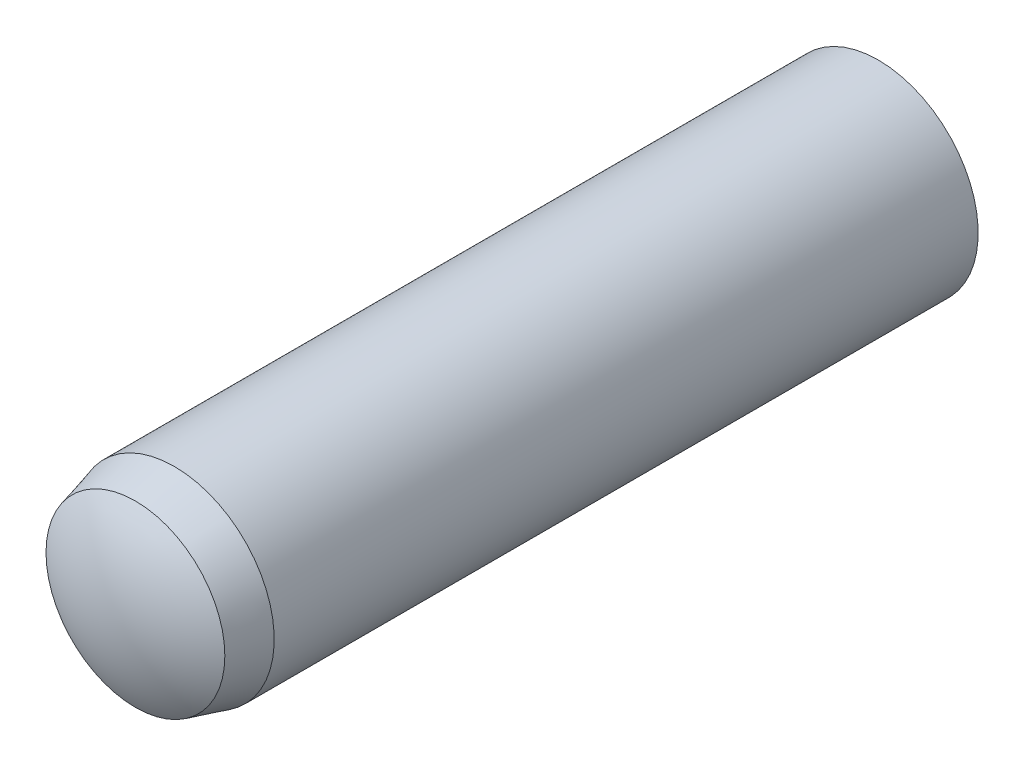
ISO-10303-21;
HEADER;
FILE_DESCRIPTION(('STEP AP214'),'2;1');
FILE_NAME('part.step','',(''),(''),'','','');
FILE_SCHEMA(('AUTOMOTIVE_DESIGN { 1 0 10303 214 1 1 1 1 }'));
ENDSEC;
DATA;
#1=APPLICATION_CONTEXT('core data for automotive mechanical design processes');
#2=APPLICATION_PROTOCOL_DEFINITION('international standard','automotive_design',2000,#1);
#3=PRODUCT_CONTEXT('',#1,'mechanical');
#4=PRODUCT('Part','Part','',(#3));
#5=PRODUCT_RELATED_PRODUCT_CATEGORY('part','',(#4));
#6=PRODUCT_DEFINITION_FORMATION('','',#4);
#7=PRODUCT_DEFINITION_CONTEXT('part definition',#1,'design');
#8=PRODUCT_DEFINITION('design','',#6,#7);
#9=PRODUCT_DEFINITION_SHAPE('','',#8);
#10=(LENGTH_UNIT() NAMED_UNIT(*) SI_UNIT(.MILLI.,.METRE.));
#11=(NAMED_UNIT(*) PLANE_ANGLE_UNIT() SI_UNIT($,.RADIAN.));
#12=(NAMED_UNIT(*) SI_UNIT($,.STERADIAN.) SOLID_ANGLE_UNIT());
#13=UNCERTAINTY_MEASURE_WITH_UNIT(LENGTH_MEASURE(1.E-05),#10,'distance_accuracy_value','');
#14=(GEOMETRIC_REPRESENTATION_CONTEXT(3) GLOBAL_UNCERTAINTY_ASSIGNED_CONTEXT((#13)) GLOBAL_UNIT_ASSIGNED_CONTEXT((#10,
#11,#12)) REPRESENTATION_CONTEXT('',''));
#15=CARTESIAN_POINT('',(0.,0.,0.));
#16=DIRECTION('',(0.,0.,1.));
#17=DIRECTION('',(1.,0.,0.));
#18=AXIS2_PLACEMENT_3D('',#15,#16,#17);
#19=CARTESIAN_POINT('',(0.,0.,-3.27500000000002));
#20=DIRECTION('',(0.,0.,1.));
#21=DIRECTION('',(0.,-1.,0.));
#22=AXIS2_PLACEMENT_3D('',#19,#20,#21);
#23=SPHERICAL_SURFACE('',#22,2.72499999999998);
#24=CARTESIAN_POINT('',(0.,0.,-5.55));
#25=DIRECTION('',(0.,0.,1.));
#26=DIRECTION('',(0.,-1.,0.));
#27=AXIS2_PLACEMENT_3D('',#24,#25,#26);
#28=CIRCLE('',#27,1.5);
#29=CARTESIAN_POINT('',(0.,-1.5,-5.55));
#30=VERTEX_POINT('',#29);
#31=EDGE_CURVE('E10',#30,#30,#28,.T.);
#32=ORIENTED_EDGE('',*,*,#31,.F.);
#33=EDGE_LOOP('',(#32));
#34=FACE_BOUND('',#33,.T.);
#35=ADVANCED_FACE('F30',(#34),#23,.T.);
#36=CARTESIAN_POINT('',(0.,0.,6.));
#37=DIRECTION('',(0.,0.,1.));
#38=DIRECTION('',(0.,-1.,0.));
#39=AXIS2_PLACEMENT_3D('',#36,#37,#38);
#40=CYLINDRICAL_SURFACE('',#39,1.5);
#41=CARTESIAN_POINT('',(0.,0.,5.025));
#42=DIRECTION('',(0.,0.,1.));
#43=DIRECTION('',(0.,-1.,0.));
#44=AXIS2_PLACEMENT_3D('',#41,#42,#43);
#45=CIRCLE('',#44,1.5);
#46=CARTESIAN_POINT('',(0.,-1.5,5.025));
#47=VERTEX_POINT('',#46);
#48=EDGE_CURVE('E36',#47,#47,#45,.T.);
#49=ORIENTED_EDGE('',*,*,#48,.F.);
#50=EDGE_LOOP('',(#49));
#51=FACE_BOUND('',#50,.T.);
#52=ORIENTED_EDGE('',*,*,#31,.T.);
#53=EDGE_LOOP('',(#52));
#54=FACE_BOUND('',#53,.T.);
#55=ADVANCED_FACE('F51',(#51,#54),#40,.T.);
#56=CARTESIAN_POINT('',(0.,0.,5.025));
#57=DIRECTION('',(0.,0.,-1.));
#58=DIRECTION('',(0.,1.,0.));
#59=AXIS2_PLACEMENT_3D('',#56,#57,#58);
#60=CONICAL_SURFACE('',#59,1.5,0.26179938779915);
#61=CARTESIAN_POINT('',(0.,0.,5.61));
#62=DIRECTION('',(0.,0.,1.));
#63=DIRECTION('',(0.,-1.,0.));
#64=AXIS2_PLACEMENT_3D('',#61,#62,#63);
#65=CIRCLE('',#64,1.34324972242779);
#66=CARTESIAN_POINT('',(0.,-1.34324972242779,5.61));
#67=VERTEX_POINT('',#66);
#68=EDGE_CURVE('E40',#67,#67,#65,.T.);
#69=ORIENTED_EDGE('',*,*,#68,.F.);
#70=EDGE_LOOP('',(#69));
#71=FACE_BOUND('',#70,.T.);
#72=ORIENTED_EDGE('',*,*,#48,.T.);
#73=EDGE_LOOP('',(#72));
#74=FACE_BOUND('',#73,.T.);
#75=ADVANCED_FACE('F49',(#71,#74),#60,.T.);
#76=CARTESIAN_POINT('',(0.,0.,3.49176946563802));
#77=DIRECTION('',(0.,0.,1.));
#78=DIRECTION('',(0.,1.,0.));
#79=AXIS2_PLACEMENT_3D('',#76,#77,#78);
#80=SPHERICAL_SURFACE('',#79,2.50823053436198);
#81=ORIENTED_EDGE('',*,*,#68,.T.);
#82=EDGE_LOOP('',(#81));
#83=FACE_BOUND('',#82,.T.);
#84=ADVANCED_FACE('F47',(#83),#80,.T.);
#85=CLOSED_SHELL('',(#35,#55,#75,#84));
#86=MANIFOLD_SOLID_BREP('B2',#85);
#87=ADVANCED_BREP_SHAPE_REPRESENTATION('',(#18,#86),#14);
#88=SHAPE_DEFINITION_REPRESENTATION(#9,#87);
ENDSEC;
END-ISO-10303-21;
